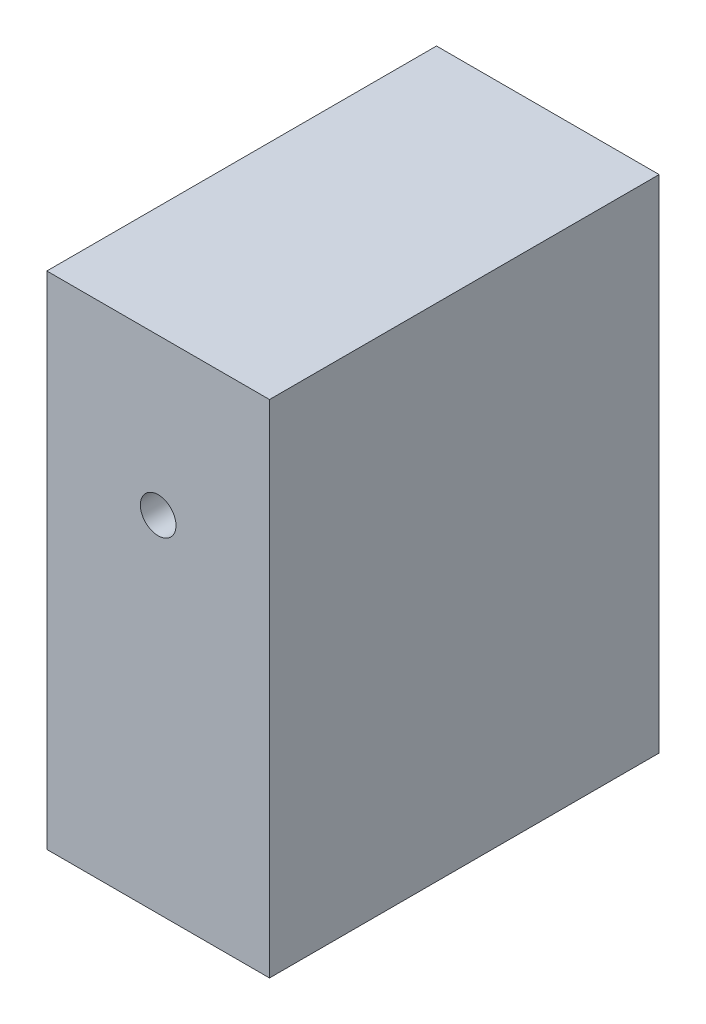
ISO-10303-21;
HEADER;
FILE_DESCRIPTION(('STEP AP214'),'2;1');
FILE_NAME('part.step','',(''),(''),'','','');
FILE_SCHEMA(('AUTOMOTIVE_DESIGN { 1 0 10303 214 1 1 1 1 }'));
ENDSEC;
DATA;
#1=APPLICATION_CONTEXT('core data for automotive mechanical design processes');
#2=APPLICATION_PROTOCOL_DEFINITION('international standard','automotive_design',2000,#1);
#3=PRODUCT_CONTEXT('',#1,'mechanical');
#4=PRODUCT('Part','Part','',(#3));
#5=PRODUCT_RELATED_PRODUCT_CATEGORY('part','',(#4));
#6=PRODUCT_DEFINITION_FORMATION('','',#4);
#7=PRODUCT_DEFINITION_CONTEXT('part definition',#1,'design');
#8=PRODUCT_DEFINITION('design','',#6,#7);
#9=PRODUCT_DEFINITION_SHAPE('','',#8);
#10=(LENGTH_UNIT() NAMED_UNIT(*) SI_UNIT(.MILLI.,.METRE.));
#11=(NAMED_UNIT(*) PLANE_ANGLE_UNIT() SI_UNIT($,.RADIAN.));
#12=(NAMED_UNIT(*) SI_UNIT($,.STERADIAN.) SOLID_ANGLE_UNIT());
#13=UNCERTAINTY_MEASURE_WITH_UNIT(LENGTH_MEASURE(1.E-05),#10,'distance_accuracy_value','');
#14=(GEOMETRIC_REPRESENTATION_CONTEXT(3) GLOBAL_UNCERTAINTY_ASSIGNED_CONTEXT((#13)) GLOBAL_UNIT_ASSIGNED_CONTEXT((#10,
#11,#12)) REPRESENTATION_CONTEXT('',''));
#15=CARTESIAN_POINT('',(0.,0.,0.));
#16=DIRECTION('',(0.,0.,1.));
#17=DIRECTION('',(1.,0.,0.));
#18=AXIS2_PLACEMENT_3D('',#15,#16,#17);
#19=CARTESIAN_POINT('',(0.,0.,35.));
#20=DIRECTION('',(0.,0.,1.));
#21=DIRECTION('',(1.,0.,0.));
#22=AXIS2_PLACEMENT_3D('',#19,#20,#21);
#23=PLANE('',#22);
#24=DIRECTION('',(0.,-1.,0.));
#25=VECTOR('',#24,1.);
#26=CARTESIAN_POINT('',(-51.7647058823529,52.9411764705883,35.));
#27=LINE('',#26,#25);
#28=CARTESIAN_POINT('',(-51.7647058823529,52.9411764705883,35.));
#29=VERTEX_POINT('',#28);
#30=CARTESIAN_POINT('',(-51.7647058823529,7.9411764705883,35.));
#31=VERTEX_POINT('',#30);
#32=EDGE_CURVE('E89',#29,#31,#27,.T.);
#33=ORIENTED_EDGE('',*,*,#32,.T.);
#34=DIRECTION('',(1.,0.,0.));
#35=VECTOR('',#34,1.);
#36=CARTESIAN_POINT('',(-51.7647058823529,7.9411764705883,35.));
#37=LINE('',#36,#35);
#38=CARTESIAN_POINT('',(-31.7647058823529,7.9411764705883,35.));
#39=VERTEX_POINT('',#38);
#40=EDGE_CURVE('E84',#31,#39,#37,.T.);
#41=ORIENTED_EDGE('',*,*,#40,.T.);
#42=DIRECTION('',(0.,1.,0.));
#43=VECTOR('',#42,1.);
#44=CARTESIAN_POINT('',(-31.7647058823529,52.9411764705883,35.));
#45=LINE('',#44,#43);
#46=CARTESIAN_POINT('',(-31.7647058823529,52.9411764705883,35.));
#47=VERTEX_POINT('',#46);
#48=EDGE_CURVE('E87',#39,#47,#45,.T.);
#49=ORIENTED_EDGE('',*,*,#48,.T.);
#50=DIRECTION('',(-1.,0.,0.));
#51=VECTOR('',#50,1.);
#52=CARTESIAN_POINT('',(-51.7647058823529,52.9411764705883,35.));
#53=LINE('',#52,#51);
#54=EDGE_CURVE('E54',#47,#29,#53,.T.);
#55=ORIENTED_EDGE('',*,*,#54,.T.);
#56=EDGE_LOOP('',(#33,#41,#49,#55));
#57=FACE_BOUND('',#56,.T.);
#58=CARTESIAN_POINT('',(-41.7647058823529,38.9411764705883,35.));
#59=DIRECTION('',(0.,0.,1.));
#60=DIRECTION('',(1.,0.,0.));
#61=AXIS2_PLACEMENT_3D('',#58,#59,#60);
#62=CIRCLE('',#61,1.60000000000001);
#63=CARTESIAN_POINT('',(-40.1647058823529,38.9411764705883,35.));
#64=VERTEX_POINT('',#63);
#65=EDGE_CURVE('E104',#64,#64,#62,.T.);
#66=ORIENTED_EDGE('',*,*,#65,.F.);
#67=EDGE_LOOP('',(#66));
#68=FACE_BOUND('',#67,.T.);
#69=ADVANCED_FACE('F37',(#57,#68),#23,.T.);
#70=CARTESIAN_POINT('',(0.,0.,0.));
#71=DIRECTION('',(0.,0.,1.));
#72=DIRECTION('',(1.,0.,0.));
#73=AXIS2_PLACEMENT_3D('',#70,#71,#72);
#74=PLANE('',#73);
#75=DIRECTION('',(0.,-1.,0.));
#76=VECTOR('',#75,1.);
#77=CARTESIAN_POINT('',(-51.7647058823529,52.9411764705883,0.));
#78=LINE('',#77,#76);
#79=CARTESIAN_POINT('',(-51.7647058823529,52.9411764705883,0.));
#80=VERTEX_POINT('',#79);
#81=CARTESIAN_POINT('',(-51.7647058823529,7.9411764705883,0.));
#82=VERTEX_POINT('',#81);
#83=EDGE_CURVE('E101',#80,#82,#78,.T.);
#84=ORIENTED_EDGE('',*,*,#83,.F.);
#85=DIRECTION('',(-1.,0.,0.));
#86=VECTOR('',#85,1.);
#87=CARTESIAN_POINT('',(-51.7647058823529,52.9411764705883,0.));
#88=LINE('',#87,#86);
#89=CARTESIAN_POINT('',(-31.7647058823529,52.9411764705883,0.));
#90=VERTEX_POINT('',#89);
#91=EDGE_CURVE('E77',#90,#80,#88,.T.);
#92=ORIENTED_EDGE('',*,*,#91,.F.);
#93=DIRECTION('',(0.,1.,0.));
#94=VECTOR('',#93,1.);
#95=CARTESIAN_POINT('',(-31.7647058823529,52.9411764705883,0.));
#96=LINE('',#95,#94);
#97=CARTESIAN_POINT('',(-31.7647058823529,7.9411764705883,0.));
#98=VERTEX_POINT('',#97);
#99=EDGE_CURVE('E71',#98,#90,#96,.T.);
#100=ORIENTED_EDGE('',*,*,#99,.F.);
#101=DIRECTION('',(1.,0.,0.));
#102=VECTOR('',#101,1.);
#103=CARTESIAN_POINT('',(-51.7647058823529,7.9411764705883,0.));
#104=LINE('',#103,#102);
#105=EDGE_CURVE('E93',#82,#98,#104,.T.);
#106=ORIENTED_EDGE('',*,*,#105,.F.);
#107=EDGE_LOOP('',(#84,#92,#100,#106));
#108=FACE_BOUND('',#107,.T.);
#109=CARTESIAN_POINT('',(-41.7647058823529,38.9411764705883,0.));
#110=DIRECTION('',(0.,0.,1.));
#111=DIRECTION('',(1.,0.,0.));
#112=AXIS2_PLACEMENT_3D('',#109,#110,#111);
#113=CIRCLE('',#112,1.60000000000001);
#114=CARTESIAN_POINT('',(-40.1647058823529,38.9411764705883,0.));
#115=VERTEX_POINT('',#114);
#116=EDGE_CURVE('E116',#115,#115,#113,.T.);
#117=ORIENTED_EDGE('',*,*,#116,.T.);
#118=EDGE_LOOP('',(#117));
#119=FACE_BOUND('',#118,.T.);
#120=ADVANCED_FACE('F112',(#108,#119),#74,.F.);
#121=CARTESIAN_POINT('',(-51.7647058823529,52.9411764705883,35.));
#122=DIRECTION('',(1.,0.,0.));
#123=DIRECTION('',(0.,0.,-1.));
#124=AXIS2_PLACEMENT_3D('',#121,#122,#123);
#125=PLANE('',#124);
#126=ORIENTED_EDGE('',*,*,#83,.T.);
#127=DIRECTION('',(0.,0.,-1.));
#128=VECTOR('',#127,1.);
#129=CARTESIAN_POINT('',(-51.7647058823529,7.9411764705883,35.));
#130=LINE('',#129,#128);
#131=EDGE_CURVE('E11',#31,#82,#130,.T.);
#132=ORIENTED_EDGE('',*,*,#131,.F.);
#133=ORIENTED_EDGE('',*,*,#32,.F.);
#134=DIRECTION('',(0.,0.,-1.));
#135=VECTOR('',#134,1.);
#136=CARTESIAN_POINT('',(-51.7647058823529,52.9411764705883,35.));
#137=LINE('',#136,#135);
#138=EDGE_CURVE('E97',#29,#80,#137,.T.);
#139=ORIENTED_EDGE('',*,*,#138,.T.);
#140=EDGE_LOOP('',(#126,#132,#133,#139));
#141=FACE_BOUND('',#140,.T.);
#142=ADVANCED_FACE('F39',(#141),#125,.F.);
#143=CARTESIAN_POINT('',(-51.7647058823529,7.9411764705883,35.));
#144=DIRECTION('',(0.,1.,0.));
#145=DIRECTION('',(0.,0.,1.));
#146=AXIS2_PLACEMENT_3D('',#143,#144,#145);
#147=PLANE('',#146);
#148=ORIENTED_EDGE('',*,*,#105,.T.);
#149=DIRECTION('',(0.,0.,-1.));
#150=VECTOR('',#149,1.);
#151=CARTESIAN_POINT('',(-31.7647058823529,7.9411764705883,35.));
#152=LINE('',#151,#150);
#153=EDGE_CURVE('E46',#39,#98,#152,.T.);
#154=ORIENTED_EDGE('',*,*,#153,.F.);
#155=ORIENTED_EDGE('',*,*,#40,.F.);
#156=ORIENTED_EDGE('',*,*,#131,.T.);
#157=EDGE_LOOP('',(#148,#154,#155,#156));
#158=FACE_BOUND('',#157,.T.);
#159=ADVANCED_FACE('F92',(#158),#147,.F.);
#160=CARTESIAN_POINT('',(-31.7647058823529,52.9411764705883,35.));
#161=DIRECTION('',(-1.,0.,0.));
#162=DIRECTION('',(0.,-1.,0.));
#163=AXIS2_PLACEMENT_3D('',#160,#161,#162);
#164=PLANE('',#163);
#165=ORIENTED_EDGE('',*,*,#99,.T.);
#166=DIRECTION('',(0.,0.,-1.));
#167=VECTOR('',#166,1.);
#168=CARTESIAN_POINT('',(-31.7647058823529,52.9411764705883,35.));
#169=LINE('',#168,#167);
#170=EDGE_CURVE('E94',#47,#90,#169,.T.);
#171=ORIENTED_EDGE('',*,*,#170,.F.);
#172=ORIENTED_EDGE('',*,*,#48,.F.);
#173=ORIENTED_EDGE('',*,*,#153,.T.);
#174=EDGE_LOOP('',(#165,#171,#172,#173));
#175=FACE_BOUND('',#174,.T.);
#176=ADVANCED_FACE('F95',(#175),#164,.F.);
#177=CARTESIAN_POINT('',(-51.7647058823529,52.9411764705883,35.));
#178=DIRECTION('',(0.,-1.,0.));
#179=DIRECTION('',(0.,0.,-1.));
#180=AXIS2_PLACEMENT_3D('',#177,#178,#179);
#181=PLANE('',#180);
#182=ORIENTED_EDGE('',*,*,#91,.T.);
#183=ORIENTED_EDGE('',*,*,#138,.F.);
#184=ORIENTED_EDGE('',*,*,#54,.F.);
#185=ORIENTED_EDGE('',*,*,#170,.T.);
#186=EDGE_LOOP('',(#182,#183,#184,#185));
#187=FACE_BOUND('',#186,.T.);
#188=ADVANCED_FACE('F109',(#187),#181,.F.);
#189=CARTESIAN_POINT('',(-41.7647058823529,38.9411764705883,35.));
#190=DIRECTION('',(0.,0.,-1.));
#191=DIRECTION('',(-1.,0.,0.));
#192=AXIS2_PLACEMENT_3D('',#189,#190,#191);
#193=CYLINDRICAL_SURFACE('',#192,1.60000000000001);
#194=ORIENTED_EDGE('',*,*,#65,.T.);
#195=EDGE_LOOP('',(#194));
#196=FACE_BOUND('',#195,.T.);
#197=ORIENTED_EDGE('',*,*,#116,.F.);
#198=EDGE_LOOP('',(#197));
#199=FACE_BOUND('',#198,.T.);
#200=ADVANCED_FACE('F122',(#196,#199),#193,.F.);
#201=CLOSED_SHELL('',(#69,#120,#142,#159,#176,#188,#200));
#202=MANIFOLD_SOLID_BREP('B2',#201);
#203=ADVANCED_BREP_SHAPE_REPRESENTATION('',(#18,#202),#14);
#204=SHAPE_DEFINITION_REPRESENTATION(#9,#203);
ENDSEC;
END-ISO-10303-21;
